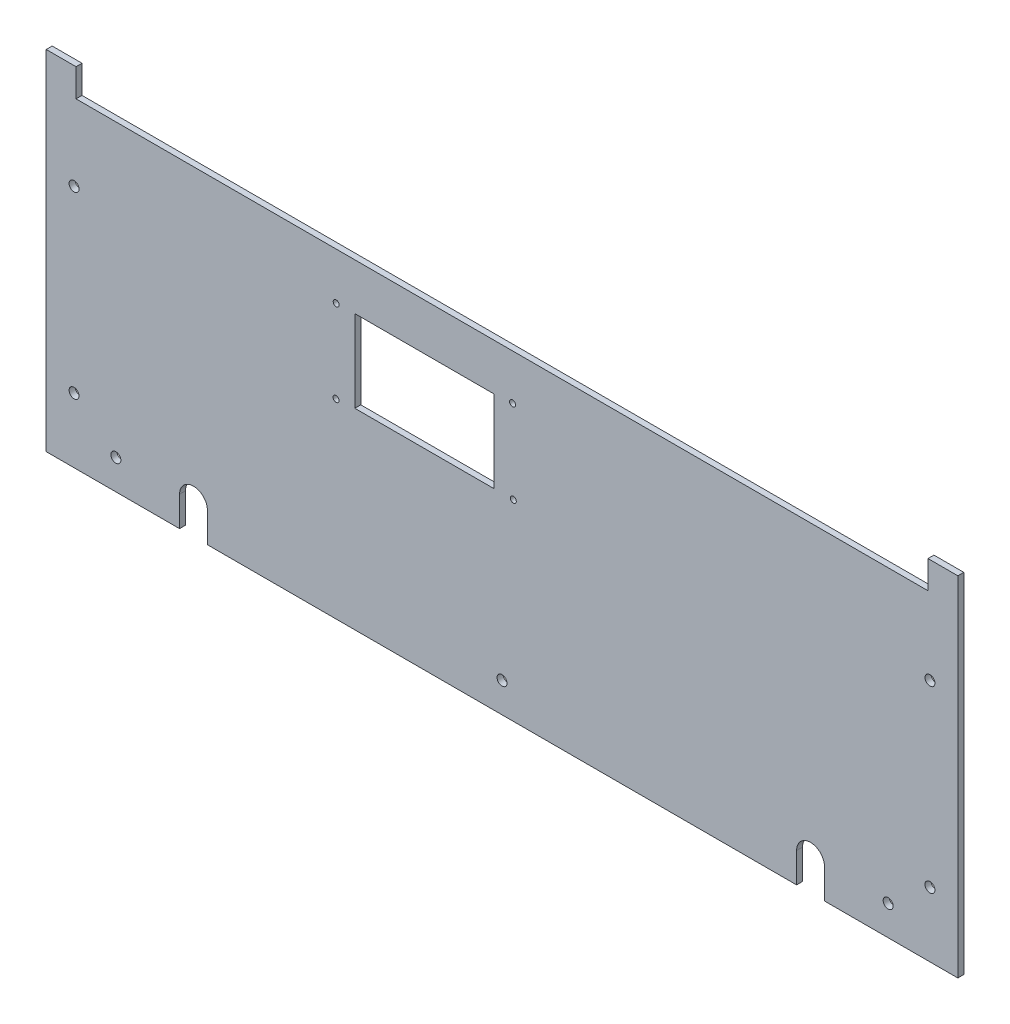
ISO-10303-21;
HEADER;
FILE_DESCRIPTION(('STEP AP214'),'2;1');
FILE_NAME('part.step','',(''),(''),'','','');
FILE_SCHEMA(('AUTOMOTIVE_DESIGN { 1 0 10303 214 1 1 1 1 }'));
ENDSEC;
DATA;
#1=APPLICATION_CONTEXT('core data for automotive mechanical design processes');
#2=APPLICATION_PROTOCOL_DEFINITION('international standard','automotive_design',2000,#1);
#3=PRODUCT_CONTEXT('',#1,'mechanical');
#4=PRODUCT('Part','Part','',(#3));
#5=PRODUCT_RELATED_PRODUCT_CATEGORY('part','',(#4));
#6=PRODUCT_DEFINITION_FORMATION('','',#4);
#7=PRODUCT_DEFINITION_CONTEXT('part definition',#1,'design');
#8=PRODUCT_DEFINITION('design','',#6,#7);
#9=PRODUCT_DEFINITION_SHAPE('','',#8);
#10=(LENGTH_UNIT() NAMED_UNIT(*) SI_UNIT(.MILLI.,.METRE.));
#11=(NAMED_UNIT(*) PLANE_ANGLE_UNIT() SI_UNIT($,.RADIAN.));
#12=(NAMED_UNIT(*) SI_UNIT($,.STERADIAN.) SOLID_ANGLE_UNIT());
#13=UNCERTAINTY_MEASURE_WITH_UNIT(LENGTH_MEASURE(1.E-05),#10,'distance_accuracy_value','');
#14=(GEOMETRIC_REPRESENTATION_CONTEXT(3) GLOBAL_UNCERTAINTY_ASSIGNED_CONTEXT((#13)) GLOBAL_UNIT_ASSIGNED_CONTEXT((#10,
#11,#12)) REPRESENTATION_CONTEXT('',''));
#15=CARTESIAN_POINT('',(0.,0.,0.));
#16=DIRECTION('',(0.,0.,1.));
#17=DIRECTION('',(1.,0.,0.));
#18=AXIS2_PLACEMENT_3D('',#15,#16,#17);
#19=CARTESIAN_POINT('',(-229.,-122.5,3.));
#20=DIRECTION('',(0.,1.,0.));
#21=DIRECTION('',(0.,0.,1.));
#22=AXIS2_PLACEMENT_3D('',#19,#20,#21);
#23=PLANE('',#22);
#24=DIRECTION('',(1.,0.,0.));
#25=VECTOR('',#24,1.);
#26=CARTESIAN_POINT('',(-229.,-122.5,3.));
#27=LINE('',#26,#25);
#28=CARTESIAN_POINT('',(-148.,-122.5,3.));
#29=VERTEX_POINT('',#28);
#30=CARTESIAN_POINT('',(148.,-122.5,3.));
#31=VERTEX_POINT('',#30);
#32=EDGE_CURVE('E201',#29,#31,#27,.T.);
#33=ORIENTED_EDGE('',*,*,#32,.F.);
#34=DIRECTION('',(0.,0.,1.));
#35=VECTOR('',#34,1.);
#36=CARTESIAN_POINT('',(-148.,-122.5,0.));
#37=LINE('',#36,#35);
#38=CARTESIAN_POINT('',(-148.,-122.5,0.));
#39=VERTEX_POINT('',#38);
#40=EDGE_CURVE('E253',#39,#29,#37,.T.);
#41=ORIENTED_EDGE('',*,*,#40,.F.);
#42=DIRECTION('',(1.,0.,0.));
#43=VECTOR('',#42,1.);
#44=CARTESIAN_POINT('',(-229.,-122.5,0.));
#45=LINE('',#44,#43);
#46=CARTESIAN_POINT('',(148.,-122.5,0.));
#47=VERTEX_POINT('',#46);
#48=EDGE_CURVE('E219',#39,#47,#45,.T.);
#49=ORIENTED_EDGE('',*,*,#48,.T.);
#50=DIRECTION('',(0.,0.,1.));
#51=VECTOR('',#50,1.);
#52=CARTESIAN_POINT('',(148.,-122.5,0.));
#53=LINE('',#52,#51);
#54=EDGE_CURVE('E261',#47,#31,#53,.T.);
#55=ORIENTED_EDGE('',*,*,#54,.T.);
#56=EDGE_LOOP('',(#33,#41,#49,#55));
#57=FACE_BOUND('',#56,.T.);
#58=ADVANCED_FACE('F41',(#57),#23,.F.);
#59=CARTESIAN_POINT('',(162.,-122.5,3.));
#60=VERTEX_POINT('',#59);
#61=CARTESIAN_POINT('',(229.,-122.5,3.));
#62=VERTEX_POINT('',#61);
#63=EDGE_CURVE('E198',#60,#62,#27,.T.);
#64=ORIENTED_EDGE('',*,*,#63,.F.);
#65=DIRECTION('',(0.,0.,1.));
#66=VECTOR('',#65,1.);
#67=CARTESIAN_POINT('',(162.,-122.5,0.));
#68=LINE('',#67,#66);
#69=CARTESIAN_POINT('',(162.,-122.5,0.));
#70=VERTEX_POINT('',#69);
#71=EDGE_CURVE('E264',#70,#60,#68,.T.);
#72=ORIENTED_EDGE('',*,*,#71,.F.);
#73=CARTESIAN_POINT('',(229.,-122.5,0.));
#74=VERTEX_POINT('',#73);
#75=EDGE_CURVE('E216',#70,#74,#45,.T.);
#76=ORIENTED_EDGE('',*,*,#75,.T.);
#77=DIRECTION('',(0.,0.,-1.));
#78=VECTOR('',#77,1.);
#79=CARTESIAN_POINT('',(229.,-122.5,3.));
#80=LINE('',#79,#78);
#81=EDGE_CURVE('E209',#62,#74,#80,.T.);
#82=ORIENTED_EDGE('',*,*,#81,.F.);
#83=EDGE_LOOP('',(#64,#72,#76,#82));
#84=FACE_BOUND('',#83,.T.);
#85=ADVANCED_FACE('F306',(#84),#23,.F.);
#86=CARTESIAN_POINT('',(229.,122.5,3.));
#87=DIRECTION('',(-1.,0.,0.));
#88=DIRECTION('',(0.,-1.,0.));
#89=AXIS2_PLACEMENT_3D('',#86,#87,#88);
#90=PLANE('',#89);
#91=DIRECTION('',(0.,1.,0.));
#92=VECTOR('',#91,1.);
#93=CARTESIAN_POINT('',(229.,122.5,0.));
#94=LINE('',#93,#92);
#95=CARTESIAN_POINT('',(229.,52.5,0.));
#96=VERTEX_POINT('',#95);
#97=EDGE_CURVE('E210',#74,#96,#94,.T.);
#98=ORIENTED_EDGE('',*,*,#97,.T.);
#99=DIRECTION('',(0.,0.,1.));
#100=VECTOR('',#99,1.);
#101=CARTESIAN_POINT('',(229.,52.5,-7.));
#102=LINE('',#101,#100);
#103=CARTESIAN_POINT('',(229.,52.5,3.));
#104=VERTEX_POINT('',#103);
#105=EDGE_CURVE('E182',#96,#104,#102,.T.);
#106=ORIENTED_EDGE('',*,*,#105,.T.);
#107=DIRECTION('',(0.,1.,0.));
#108=VECTOR('',#107,1.);
#109=CARTESIAN_POINT('',(229.,122.5,3.));
#110=LINE('',#109,#108);
#111=EDGE_CURVE('E199',#62,#104,#110,.T.);
#112=ORIENTED_EDGE('',*,*,#111,.F.);
#113=ORIENTED_EDGE('',*,*,#81,.T.);
#114=EDGE_LOOP('',(#98,#106,#112,#113));
#115=FACE_BOUND('',#114,.T.);
#116=ADVANCED_FACE('F43',(#115),#90,.F.);
#117=CARTESIAN_POINT('',(-229.,122.5,3.));
#118=DIRECTION('',(1.,0.,0.));
#119=DIRECTION('',(0.,0.,-1.));
#120=AXIS2_PLACEMENT_3D('',#117,#118,#119);
#121=PLANE('',#120);
#122=DIRECTION('',(0.,-1.,0.));
#123=VECTOR('',#122,1.);
#124=CARTESIAN_POINT('',(-229.,122.5,3.));
#125=LINE('',#124,#123);
#126=CARTESIAN_POINT('',(-229.,52.5,3.));
#127=VERTEX_POINT('',#126);
#128=CARTESIAN_POINT('',(-229.,-122.5,3.));
#129=VERTEX_POINT('',#128);
#130=EDGE_CURVE('E189',#127,#129,#125,.T.);
#131=ORIENTED_EDGE('',*,*,#130,.F.);
#132=DIRECTION('',(0.,0.,1.));
#133=VECTOR('',#132,1.);
#134=CARTESIAN_POINT('',(-229.,52.5,-7.));
#135=LINE('',#134,#133);
#136=CARTESIAN_POINT('',(-229.,52.5,0.));
#137=VERTEX_POINT('',#136);
#138=EDGE_CURVE('E175',#137,#127,#135,.T.);
#139=ORIENTED_EDGE('',*,*,#138,.F.);
#140=DIRECTION('',(0.,-1.,0.));
#141=VECTOR('',#140,1.);
#142=CARTESIAN_POINT('',(-229.,122.5,0.));
#143=LINE('',#142,#141);
#144=CARTESIAN_POINT('',(-229.,-122.5,0.));
#145=VERTEX_POINT('',#144);
#146=EDGE_CURVE('E213',#137,#145,#143,.T.);
#147=ORIENTED_EDGE('',*,*,#146,.T.);
#148=DIRECTION('',(0.,0.,-1.));
#149=VECTOR('',#148,1.);
#150=CARTESIAN_POINT('',(-229.,-122.5,3.));
#151=LINE('',#150,#149);
#152=EDGE_CURVE('E49',#129,#145,#151,.T.);
#153=ORIENTED_EDGE('',*,*,#152,.F.);
#154=EDGE_LOOP('',(#131,#139,#147,#153));
#155=FACE_BOUND('',#154,.T.);
#156=ADVANCED_FACE('F195',(#155),#121,.F.);
#157=CARTESIAN_POINT('',(-162.,-122.5,0.));
#158=VERTEX_POINT('',#157);
#159=EDGE_CURVE('E205',#145,#158,#45,.T.);
#160=ORIENTED_EDGE('',*,*,#159,.T.);
#161=DIRECTION('',(0.,0.,1.));
#162=VECTOR('',#161,1.);
#163=CARTESIAN_POINT('',(-162.,-122.5,0.));
#164=LINE('',#163,#162);
#165=CARTESIAN_POINT('',(-162.,-122.5,3.));
#166=VERTEX_POINT('',#165);
#167=EDGE_CURVE('E255',#158,#166,#164,.T.);
#168=ORIENTED_EDGE('',*,*,#167,.T.);
#169=EDGE_CURVE('E203',#129,#166,#27,.T.);
#170=ORIENTED_EDGE('',*,*,#169,.F.);
#171=ORIENTED_EDGE('',*,*,#152,.T.);
#172=EDGE_LOOP('',(#160,#168,#170,#171));
#173=FACE_BOUND('',#172,.T.);
#174=ADVANCED_FACE('F223',(#173),#23,.F.);
#175=CARTESIAN_POINT('',(0.,0.,3.));
#176=DIRECTION('',(0.,0.,1.));
#177=DIRECTION('',(1.,0.,0.));
#178=AXIS2_PLACEMENT_3D('',#175,#176,#177);
#179=PLANE('',#178);
#180=DIRECTION('',(1.,0.,0.));
#181=VECTOR('',#180,1.);
#182=CARTESIAN_POINT('',(-229.,52.5,3.));
#183=LINE('',#182,#181);
#184=CARTESIAN_POINT('',(-214.,52.5,3.));
#185=VERTEX_POINT('',#184);
#186=EDGE_CURVE('E56',#127,#185,#183,.T.);
#187=ORIENTED_EDGE('',*,*,#186,.F.);
#188=ORIENTED_EDGE('',*,*,#130,.T.);
#189=ORIENTED_EDGE('',*,*,#169,.T.);
#190=DIRECTION('',(0.,-1.,0.));
#191=VECTOR('',#190,1.);
#192=CARTESIAN_POINT('',(-162.,-107.5,3.));
#193=LINE('',#192,#191);
#194=CARTESIAN_POINT('',(-162.,-107.5,3.));
#195=VERTEX_POINT('',#194);
#196=EDGE_CURVE('E247',#195,#166,#193,.T.);
#197=ORIENTED_EDGE('',*,*,#196,.F.);
#198=CARTESIAN_POINT('',(-155.,-107.5,3.));
#199=DIRECTION('',(0.,0.,1.));
#200=DIRECTION('',(1.,0.,0.));
#201=AXIS2_PLACEMENT_3D('',#198,#199,#200);
#202=CIRCLE('',#201,6.99999999999998);
#203=CARTESIAN_POINT('',(-148.,-107.5,3.));
#204=VERTEX_POINT('',#203);
#205=EDGE_CURVE('E244',#204,#195,#202,.T.);
#206=ORIENTED_EDGE('',*,*,#205,.F.);
#207=DIRECTION('',(0.,1.,0.));
#208=VECTOR('',#207,1.);
#209=CARTESIAN_POINT('',(-148.,-107.5,3.));
#210=LINE('',#209,#208);
#211=EDGE_CURVE('E240',#29,#204,#210,.T.);
#212=ORIENTED_EDGE('',*,*,#211,.F.);
#213=ORIENTED_EDGE('',*,*,#32,.T.);
#214=DIRECTION('',(0.,-1.,0.));
#215=VECTOR('',#214,1.);
#216=CARTESIAN_POINT('',(148.,-107.5,3.));
#217=LINE('',#216,#215);
#218=CARTESIAN_POINT('',(148.,-107.5,3.));
#219=VERTEX_POINT('',#218);
#220=EDGE_CURVE('E272',#219,#31,#217,.T.);
#221=ORIENTED_EDGE('',*,*,#220,.F.);
#222=CARTESIAN_POINT('',(155.,-107.5,3.));
#223=DIRECTION('',(0.,0.,1.));
#224=DIRECTION('',(1.,0.,0.));
#225=AXIS2_PLACEMENT_3D('',#222,#223,#224);
#226=CIRCLE('',#225,7.00000000000001);
#227=CARTESIAN_POINT('',(162.,-107.5,3.));
#228=VERTEX_POINT('',#227);
#229=EDGE_CURVE('E248',#228,#219,#226,.T.);
#230=ORIENTED_EDGE('',*,*,#229,.F.);
#231=DIRECTION('',(0.,1.,0.));
#232=VECTOR('',#231,1.);
#233=CARTESIAN_POINT('',(162.,-107.5,3.));
#234=LINE('',#233,#232);
#235=EDGE_CURVE('E269',#60,#228,#234,.T.);
#236=ORIENTED_EDGE('',*,*,#235,.F.);
#237=ORIENTED_EDGE('',*,*,#63,.T.);
#238=ORIENTED_EDGE('',*,*,#111,.T.);
#239=CARTESIAN_POINT('',(214.,52.5,3.));
#240=VERTEX_POINT('',#239);
#241=EDGE_CURVE('E193',#240,#104,#183,.T.);
#242=ORIENTED_EDGE('',*,*,#241,.F.);
#243=DIRECTION('',(0.,1.,0.));
#244=VECTOR('',#243,1.);
#245=CARTESIAN_POINT('',(214.,38.5,3.));
#246=LINE('',#245,#244);
#247=CARTESIAN_POINT('',(214.,38.5,3.));
#248=VERTEX_POINT('',#247);
#249=EDGE_CURVE('E366',#248,#240,#246,.T.);
#250=ORIENTED_EDGE('',*,*,#249,.F.);
#251=DIRECTION('',(1.,0.,0.));
#252=VECTOR('',#251,1.);
#253=CARTESIAN_POINT('',(-214.,38.5,3.));
#254=LINE('',#253,#252);
#255=CARTESIAN_POINT('',(-214.,38.5,3.));
#256=VERTEX_POINT('',#255);
#257=EDGE_CURVE('E371',#256,#248,#254,.T.);
#258=ORIENTED_EDGE('',*,*,#257,.F.);
#259=DIRECTION('',(0.,-1.,0.));
#260=VECTOR('',#259,1.);
#261=CARTESIAN_POINT('',(-214.,67.5,3.));
#262=LINE('',#261,#260);
#263=EDGE_CURVE('E192',#185,#256,#262,.T.);
#264=ORIENTED_EDGE('',*,*,#263,.F.);
#265=EDGE_LOOP('',(#187,#188,#189,#197,#206,#212,#213,#221,#230,#236,#237,#238,#242,#250,#258,#264));
#266=FACE_BOUND('',#265,.T.);
#267=CARTESIAN_POINT('',(-83.3679976732874,-26.7379466906975,3.));
#268=DIRECTION('',(0.,0.,1.));
#269=DIRECTION('',(1.,0.,0.));
#270=AXIS2_PLACEMENT_3D('',#267,#268,#269);
#271=CIRCLE('',#270,1.5);
#272=CARTESIAN_POINT('',(-81.8679976732874,-26.7379466906975,3.));
#273=VERTEX_POINT('',#272);
#274=EDGE_CURVE('E321',#273,#273,#271,.T.);
#275=ORIENTED_EDGE('',*,*,#274,.F.);
#276=EDGE_LOOP('',(#275));
#277=FACE_BOUND('',#276,.T.);
#278=CARTESIAN_POINT('',(-83.3,14.88,3.));
#279=DIRECTION('',(0.,0.,1.));
#280=DIRECTION('',(1.,0.,0.));
#281=AXIS2_PLACEMENT_3D('',#278,#279,#280);
#282=CIRCLE('',#281,1.5);
#283=CARTESIAN_POINT('',(-81.8,14.88,3.));
#284=VERTEX_POINT('',#283);
#285=EDGE_CURVE('E838',#284,#284,#282,.T.);
#286=ORIENTED_EDGE('',*,*,#285,.F.);
#287=EDGE_LOOP('',(#286));
#288=FACE_BOUND('',#287,.T.);
#289=CARTESIAN_POINT('',(5.67968750052569,-26.0546733918897,3.));
#290=DIRECTION('',(0.,0.,1.));
#291=DIRECTION('',(1.,0.,0.));
#292=AXIS2_PLACEMENT_3D('',#289,#290,#291);
#293=CIRCLE('',#292,1.5);
#294=CARTESIAN_POINT('',(7.17968750052569,-26.0546733918897,3.));
#295=VERTEX_POINT('',#294);
#296=EDGE_CURVE('E830',#295,#295,#293,.T.);
#297=ORIENTED_EDGE('',*,*,#296,.F.);
#298=EDGE_LOOP('',(#297));
#299=FACE_BOUND('',#298,.T.);
#300=CARTESIAN_POINT('',(5.2961722641175,15.7035655085171,3.));
#301=DIRECTION('',(0.,0.,1.));
#302=DIRECTION('',(1.,0.,0.));
#303=AXIS2_PLACEMENT_3D('',#300,#301,#302);
#304=CIRCLE('',#303,1.5);
#305=CARTESIAN_POINT('',(6.7961722641175,15.7035655085171,3.));
#306=VERTEX_POINT('',#305);
#307=EDGE_CURVE('E347',#306,#306,#304,.T.);
#308=ORIENTED_EDGE('',*,*,#307,.F.);
#309=EDGE_LOOP('',(#308));
#310=FACE_BOUND('',#309,.T.);
#311=DIRECTION('',(0.,1.,0.));
#312=VECTOR('',#311,1.);
#313=CARTESIAN_POINT('',(-4.05000000000001,15.1,3.));
#314=LINE('',#313,#312);
#315=CARTESIAN_POINT('',(-4.05,-26.1,3.));
#316=VERTEX_POINT('',#315);
#317=CARTESIAN_POINT('',(-4.05000000000001,15.1,3.));
#318=VERTEX_POINT('',#317);
#319=EDGE_CURVE('E344',#316,#318,#314,.T.);
#320=ORIENTED_EDGE('',*,*,#319,.F.);
#321=DIRECTION('',(1.,0.,0.));
#322=VECTOR('',#321,1.);
#323=CARTESIAN_POINT('',(-73.95,-26.1,3.));
#324=LINE('',#323,#322);
#325=CARTESIAN_POINT('',(-73.95,-26.1,3.));
#326=VERTEX_POINT('',#325);
#327=EDGE_CURVE('E334',#326,#316,#324,.T.);
#328=ORIENTED_EDGE('',*,*,#327,.F.);
#329=DIRECTION('',(0.,-1.,0.));
#330=VECTOR('',#329,1.);
#331=CARTESIAN_POINT('',(-73.95,15.1,3.));
#332=LINE('',#331,#330);
#333=CARTESIAN_POINT('',(-73.95,15.1,3.));
#334=VERTEX_POINT('',#333);
#335=EDGE_CURVE('E350',#334,#326,#332,.T.);
#336=ORIENTED_EDGE('',*,*,#335,.F.);
#337=DIRECTION('',(-1.,0.,0.));
#338=VECTOR('',#337,1.);
#339=CARTESIAN_POINT('',(-73.95,15.1,3.));
#340=LINE('',#339,#338);
#341=EDGE_CURVE('E346',#318,#334,#340,.T.);
#342=ORIENTED_EDGE('',*,*,#341,.F.);
#343=EDGE_LOOP('',(#320,#328,#336,#342));
#344=FACE_BOUND('',#343,.T.);
#345=CARTESIAN_POINT('',(215.,-90.,3.));
#346=DIRECTION('',(0.,0.,1.));
#347=DIRECTION('',(1.,0.,0.));
#348=AXIS2_PLACEMENT_3D('',#345,#346,#347);
#349=CIRCLE('',#348,2.50000000000002);
#350=CARTESIAN_POINT('',(217.5,-90.,3.));
#351=VERTEX_POINT('',#350);
#352=EDGE_CURVE('E400',#351,#351,#349,.T.);
#353=ORIENTED_EDGE('',*,*,#352,.F.);
#354=EDGE_LOOP('',(#353));
#355=FACE_BOUND('',#354,.T.);
#356=CARTESIAN_POINT('',(215.,0.,3.));
#357=DIRECTION('',(0.,0.,1.));
#358=DIRECTION('',(1.,0.,0.));
#359=AXIS2_PLACEMENT_3D('',#356,#357,#358);
#360=CIRCLE('',#359,2.50000000000002);
#361=CARTESIAN_POINT('',(217.5,0.,3.));
#362=VERTEX_POINT('',#361);
#363=EDGE_CURVE('E394',#362,#362,#360,.T.);
#364=ORIENTED_EDGE('',*,*,#363,.F.);
#365=EDGE_LOOP('',(#364));
#366=FACE_BOUND('',#365,.T.);
#367=CARTESIAN_POINT('',(-215.,-90.0000000000001,3.));
#368=DIRECTION('',(0.,0.,1.));
#369=DIRECTION('',(1.,0.,0.));
#370=AXIS2_PLACEMENT_3D('',#367,#368,#369);
#371=CIRCLE('',#370,2.49999999999997);
#372=CARTESIAN_POINT('',(-212.5,-90.0000000000001,3.));
#373=VERTEX_POINT('',#372);
#374=EDGE_CURVE('E387',#373,#373,#371,.T.);
#375=ORIENTED_EDGE('',*,*,#374,.F.);
#376=EDGE_LOOP('',(#375));
#377=FACE_BOUND('',#376,.T.);
#378=CARTESIAN_POINT('',(-215.,0.,3.));
#379=DIRECTION('',(0.,0.,1.));
#380=DIRECTION('',(1.,0.,0.));
#381=AXIS2_PLACEMENT_3D('',#378,#379,#380);
#382=CIRCLE('',#381,2.49999999999997);
#383=CARTESIAN_POINT('',(-212.5,0.,3.));
#384=VERTEX_POINT('',#383);
#385=EDGE_CURVE('E416',#384,#384,#382,.T.);
#386=ORIENTED_EDGE('',*,*,#385,.F.);
#387=EDGE_LOOP('',(#386));
#388=FACE_BOUND('',#387,.T.);
#389=CARTESIAN_POINT('',(194.,-107.5,3.));
#390=DIRECTION('',(0.,0.,1.));
#391=DIRECTION('',(1.,0.,0.));
#392=AXIS2_PLACEMENT_3D('',#389,#390,#391);
#393=CIRCLE('',#392,2.50000000000009);
#394=CARTESIAN_POINT('',(196.5,-107.5,3.));
#395=VERTEX_POINT('',#394);
#396=EDGE_CURVE('E410',#395,#395,#393,.T.);
#397=ORIENTED_EDGE('',*,*,#396,.F.);
#398=EDGE_LOOP('',(#397));
#399=FACE_BOUND('',#398,.T.);
#400=CARTESIAN_POINT('',(-194.,-107.5,3.));
#401=DIRECTION('',(0.,0.,1.));
#402=DIRECTION('',(1.,0.,0.));
#403=AXIS2_PLACEMENT_3D('',#400,#401,#402);
#404=CIRCLE('',#403,2.50000000000002);
#405=CARTESIAN_POINT('',(-191.5,-107.5,3.));
#406=VERTEX_POINT('',#405);
#407=EDGE_CURVE('E268',#406,#406,#404,.T.);
#408=ORIENTED_EDGE('',*,*,#407,.F.);
#409=EDGE_LOOP('',(#408));
#410=FACE_BOUND('',#409,.T.);
#411=CARTESIAN_POINT('',(0.,-107.5,3.));
#412=DIRECTION('',(0.,0.,1.));
#413=DIRECTION('',(1.,0.,0.));
#414=AXIS2_PLACEMENT_3D('',#411,#412,#413);
#415=CIRCLE('',#414,2.50000000000001);
#416=CARTESIAN_POINT('',(2.50000000000002,-107.5,3.));
#417=VERTEX_POINT('',#416);
#418=EDGE_CURVE('E381',#417,#417,#415,.T.);
#419=ORIENTED_EDGE('',*,*,#418,.F.);
#420=EDGE_LOOP('',(#419));
#421=FACE_BOUND('',#420,.T.);
#422=ADVANCED_FACE('F186',(#266,#277,#288,#299,#310,#344,#355,#366,#377,#388,#399,#410,#421),
#179,.T.);
#423=CARTESIAN_POINT('',(0.,0.,0.));
#424=DIRECTION('',(0.,0.,1.));
#425=DIRECTION('',(1.,0.,0.));
#426=AXIS2_PLACEMENT_3D('',#423,#424,#425);
#427=PLANE('',#426);
#428=CARTESIAN_POINT('',(-83.3679976732874,-26.7379466906975,0.));
#429=DIRECTION('',(0.,0.,1.));
#430=DIRECTION('',(1.,0.,0.));
#431=AXIS2_PLACEMENT_3D('',#428,#429,#430);
#432=CIRCLE('',#431,1.5);
#433=CARTESIAN_POINT('',(-81.8679976732874,-26.7379466906975,0.));
#434=VERTEX_POINT('',#433);
#435=EDGE_CURVE('E318',#434,#434,#432,.T.);
#436=ORIENTED_EDGE('',*,*,#435,.T.);
#437=EDGE_LOOP('',(#436));
#438=FACE_BOUND('',#437,.T.);
#439=CARTESIAN_POINT('',(-83.3,14.88,0.));
#440=DIRECTION('',(0.,0.,1.));
#441=DIRECTION('',(1.,0.,0.));
#442=AXIS2_PLACEMENT_3D('',#439,#440,#441);
#443=CIRCLE('',#442,1.5);
#444=CARTESIAN_POINT('',(-81.8,14.88,0.));
#445=VERTEX_POINT('',#444);
#446=EDGE_CURVE('E326',#445,#445,#443,.T.);
#447=ORIENTED_EDGE('',*,*,#446,.T.);
#448=EDGE_LOOP('',(#447));
#449=FACE_BOUND('',#448,.T.);
#450=CARTESIAN_POINT('',(5.67968750052569,-26.0546733918897,0.));
#451=DIRECTION('',(0.,0.,1.));
#452=DIRECTION('',(1.,0.,0.));
#453=AXIS2_PLACEMENT_3D('',#450,#451,#452);
#454=CIRCLE('',#453,1.5);
#455=CARTESIAN_POINT('',(7.17968750052569,-26.0546733918897,0.));
#456=VERTEX_POINT('',#455);
#457=EDGE_CURVE('E807',#456,#456,#454,.T.);
#458=ORIENTED_EDGE('',*,*,#457,.T.);
#459=EDGE_LOOP('',(#458));
#460=FACE_BOUND('',#459,.T.);
#461=CARTESIAN_POINT('',(5.2961722641175,15.7035655085171,0.));
#462=DIRECTION('',(0.,0.,1.));
#463=DIRECTION('',(1.,0.,0.));
#464=AXIS2_PLACEMENT_3D('',#461,#462,#463);
#465=CIRCLE('',#464,1.5);
#466=CARTESIAN_POINT('',(6.7961722641175,15.7035655085171,0.));
#467=VERTEX_POINT('',#466);
#468=EDGE_CURVE('E811',#467,#467,#465,.T.);
#469=ORIENTED_EDGE('',*,*,#468,.T.);
#470=EDGE_LOOP('',(#469));
#471=FACE_BOUND('',#470,.T.);
#472=DIRECTION('',(1.,0.,0.));
#473=VECTOR('',#472,1.);
#474=CARTESIAN_POINT('',(-73.95,-26.1,0.));
#475=LINE('',#474,#473);
#476=CARTESIAN_POINT('',(-73.95,-26.1,0.));
#477=VERTEX_POINT('',#476);
#478=CARTESIAN_POINT('',(-4.05,-26.1,0.));
#479=VERTEX_POINT('',#478);
#480=EDGE_CURVE('E340',#477,#479,#475,.T.);
#481=ORIENTED_EDGE('',*,*,#480,.T.);
#482=DIRECTION('',(0.,1.,0.));
#483=VECTOR('',#482,1.);
#484=CARTESIAN_POINT('',(-4.05000000000001,15.1,0.));
#485=LINE('',#484,#483);
#486=CARTESIAN_POINT('',(-4.05000000000001,15.1,0.));
#487=VERTEX_POINT('',#486);
#488=EDGE_CURVE('E330',#479,#487,#485,.T.);
#489=ORIENTED_EDGE('',*,*,#488,.T.);
#490=DIRECTION('',(-1.,0.,0.));
#491=VECTOR('',#490,1.);
#492=CARTESIAN_POINT('',(-73.95,15.1,0.));
#493=LINE('',#492,#491);
#494=CARTESIAN_POINT('',(-73.95,15.1,0.));
#495=VERTEX_POINT('',#494);
#496=EDGE_CURVE('E333',#487,#495,#493,.T.);
#497=ORIENTED_EDGE('',*,*,#496,.T.);
#498=DIRECTION('',(0.,-1.,0.));
#499=VECTOR('',#498,1.);
#500=CARTESIAN_POINT('',(-73.95,15.1,0.));
#501=LINE('',#500,#499);
#502=EDGE_CURVE('E337',#495,#477,#501,.T.);
#503=ORIENTED_EDGE('',*,*,#502,.T.);
#504=EDGE_LOOP('',(#481,#489,#497,#503));
#505=FACE_BOUND('',#504,.T.);
#506=ORIENTED_EDGE('',*,*,#146,.F.);
#507=DIRECTION('',(1.,0.,0.));
#508=VECTOR('',#507,1.);
#509=CARTESIAN_POINT('',(0.,52.5,0.));
#510=LINE('',#509,#508);
#511=CARTESIAN_POINT('',(-214.,52.5,0.));
#512=VERTEX_POINT('',#511);
#513=EDGE_CURVE('E178',#137,#512,#510,.T.);
#514=ORIENTED_EDGE('',*,*,#513,.T.);
#515=DIRECTION('',(0.,-1.,0.));
#516=VECTOR('',#515,1.);
#517=CARTESIAN_POINT('',(-214.,67.5,0.));
#518=LINE('',#517,#516);
#519=CARTESIAN_POINT('',(-214.,38.5,0.));
#520=VERTEX_POINT('',#519);
#521=EDGE_CURVE('E363',#512,#520,#518,.T.);
#522=ORIENTED_EDGE('',*,*,#521,.T.);
#523=DIRECTION('',(1.,0.,0.));
#524=VECTOR('',#523,1.);
#525=CARTESIAN_POINT('',(-214.,38.5,0.));
#526=LINE('',#525,#524);
#527=CARTESIAN_POINT('',(214.,38.5,0.));
#528=VERTEX_POINT('',#527);
#529=EDGE_CURVE('E365',#520,#528,#526,.T.);
#530=ORIENTED_EDGE('',*,*,#529,.T.);
#531=DIRECTION('',(0.,1.,0.));
#532=VECTOR('',#531,1.);
#533=CARTESIAN_POINT('',(214.,38.5,0.));
#534=LINE('',#533,#532);
#535=CARTESIAN_POINT('',(214.,52.5,0.));
#536=VERTEX_POINT('',#535);
#537=EDGE_CURVE('E313',#528,#536,#534,.T.);
#538=ORIENTED_EDGE('',*,*,#537,.T.);
#539=EDGE_CURVE('E64',#536,#96,#510,.T.);
#540=ORIENTED_EDGE('',*,*,#539,.T.);
#541=ORIENTED_EDGE('',*,*,#97,.F.);
#542=ORIENTED_EDGE('',*,*,#75,.F.);
#543=DIRECTION('',(0.,1.,0.));
#544=VECTOR('',#543,1.);
#545=CARTESIAN_POINT('',(162.,-107.5,0.));
#546=LINE('',#545,#544);
#547=CARTESIAN_POINT('',(162.,-107.5,0.));
#548=VERTEX_POINT('',#547);
#549=EDGE_CURVE('E260',#70,#548,#546,.T.);
#550=ORIENTED_EDGE('',*,*,#549,.T.);
#551=CARTESIAN_POINT('',(155.,-107.5,0.));
#552=DIRECTION('',(0.,0.,1.));
#553=DIRECTION('',(1.,0.,0.));
#554=AXIS2_PLACEMENT_3D('',#551,#552,#553);
#555=CIRCLE('',#554,7.00000000000001);
#556=CARTESIAN_POINT('',(148.,-107.5,0.));
#557=VERTEX_POINT('',#556);
#558=EDGE_CURVE('E273',#548,#557,#555,.T.);
#559=ORIENTED_EDGE('',*,*,#558,.T.);
#560=DIRECTION('',(0.,-1.,0.));
#561=VECTOR('',#560,1.);
#562=CARTESIAN_POINT('',(148.,-107.5,0.));
#563=LINE('',#562,#561);
#564=EDGE_CURVE('E279',#557,#47,#563,.T.);
#565=ORIENTED_EDGE('',*,*,#564,.T.);
#566=ORIENTED_EDGE('',*,*,#48,.F.);
#567=DIRECTION('',(0.,1.,0.));
#568=VECTOR('',#567,1.);
#569=CARTESIAN_POINT('',(-148.,-107.5,0.));
#570=LINE('',#569,#568);
#571=CARTESIAN_POINT('',(-148.,-107.5,0.));
#572=VERTEX_POINT('',#571);
#573=EDGE_CURVE('E236',#39,#572,#570,.T.);
#574=ORIENTED_EDGE('',*,*,#573,.T.);
#575=CARTESIAN_POINT('',(-155.,-107.5,0.));
#576=DIRECTION('',(0.,0.,1.));
#577=DIRECTION('',(1.,0.,0.));
#578=AXIS2_PLACEMENT_3D('',#575,#576,#577);
#579=CIRCLE('',#578,6.99999999999998);
#580=CARTESIAN_POINT('',(-162.,-107.5,0.));
#581=VERTEX_POINT('',#580);
#582=EDGE_CURVE('E234',#572,#581,#579,.T.);
#583=ORIENTED_EDGE('',*,*,#582,.T.);
#584=DIRECTION('',(0.,-1.,0.));
#585=VECTOR('',#584,1.);
#586=CARTESIAN_POINT('',(-162.,-107.5,0.));
#587=LINE('',#586,#585);
#588=EDGE_CURVE('E231',#581,#158,#587,.T.);
#589=ORIENTED_EDGE('',*,*,#588,.T.);
#590=ORIENTED_EDGE('',*,*,#159,.F.);
#591=EDGE_LOOP('',(#506,#514,#522,#530,#538,#540,#541,#542,#550,#559,#565,#566,#574,#583,#589,#590));
#592=FACE_BOUND('',#591,.T.);
#593=CARTESIAN_POINT('',(215.,-90.,0.));
#594=DIRECTION('',(0.,0.,1.));
#595=DIRECTION('',(1.,0.,0.));
#596=AXIS2_PLACEMENT_3D('',#593,#594,#595);
#597=CIRCLE('',#596,2.50000000000002);
#598=CARTESIAN_POINT('',(217.5,-90.,0.));
#599=VERTEX_POINT('',#598);
#600=EDGE_CURVE('E384',#599,#599,#597,.T.);
#601=ORIENTED_EDGE('',*,*,#600,.T.);
#602=EDGE_LOOP('',(#601));
#603=FACE_BOUND('',#602,.T.);
#604=CARTESIAN_POINT('',(215.,0.,0.));
#605=DIRECTION('',(0.,0.,1.));
#606=DIRECTION('',(1.,0.,0.));
#607=AXIS2_PLACEMENT_3D('',#604,#605,#606);
#608=CIRCLE('',#607,2.50000000000002);
#609=CARTESIAN_POINT('',(217.5,0.,0.));
#610=VERTEX_POINT('',#609);
#611=EDGE_CURVE('E397',#610,#610,#608,.T.);
#612=ORIENTED_EDGE('',*,*,#611,.T.);
#613=EDGE_LOOP('',(#612));
#614=FACE_BOUND('',#613,.T.);
#615=CARTESIAN_POINT('',(-215.,-90.0000000000001,0.));
#616=DIRECTION('',(0.,0.,1.));
#617=DIRECTION('',(1.,0.,0.));
#618=AXIS2_PLACEMENT_3D('',#615,#616,#617);
#619=CIRCLE('',#618,2.49999999999997);
#620=CARTESIAN_POINT('',(-212.5,-90.0000000000001,0.));
#621=VERTEX_POINT('',#620);
#622=EDGE_CURVE('E391',#621,#621,#619,.T.);
#623=ORIENTED_EDGE('',*,*,#622,.T.);
#624=EDGE_LOOP('',(#623));
#625=FACE_BOUND('',#624,.T.);
#626=CARTESIAN_POINT('',(-215.,0.,0.));
#627=DIRECTION('',(0.,0.,1.));
#628=DIRECTION('',(1.,0.,0.));
#629=AXIS2_PLACEMENT_3D('',#626,#627,#628);
#630=CIRCLE('',#629,2.49999999999997);
#631=CARTESIAN_POINT('',(-212.5,0.,0.));
#632=VERTEX_POINT('',#631);
#633=EDGE_CURVE('E390',#632,#632,#630,.T.);
#634=ORIENTED_EDGE('',*,*,#633,.T.);
#635=EDGE_LOOP('',(#634));
#636=FACE_BOUND('',#635,.T.);
#637=CARTESIAN_POINT('',(194.,-107.5,0.));
#638=DIRECTION('',(0.,0.,1.));
#639=DIRECTION('',(1.,0.,0.));
#640=AXIS2_PLACEMENT_3D('',#637,#638,#639);
#641=CIRCLE('',#640,2.50000000000009);
#642=CARTESIAN_POINT('',(196.5,-107.5,0.));
#643=VERTEX_POINT('',#642);
#644=EDGE_CURVE('E413',#643,#643,#641,.T.);
#645=ORIENTED_EDGE('',*,*,#644,.T.);
#646=EDGE_LOOP('',(#645));
#647=FACE_BOUND('',#646,.T.);
#648=CARTESIAN_POINT('',(-194.,-107.5,0.));
#649=DIRECTION('',(0.,0.,1.));
#650=DIRECTION('',(1.,0.,0.));
#651=AXIS2_PLACEMENT_3D('',#648,#649,#650);
#652=CIRCLE('',#651,2.50000000000002);
#653=CARTESIAN_POINT('',(-191.5,-107.5,0.));
#654=VERTEX_POINT('',#653);
#655=EDGE_CURVE('E407',#654,#654,#652,.T.);
#656=ORIENTED_EDGE('',*,*,#655,.T.);
#657=EDGE_LOOP('',(#656));
#658=FACE_BOUND('',#657,.T.);
#659=CARTESIAN_POINT('',(0.,-107.5,0.));
#660=DIRECTION('',(0.,0.,1.));
#661=DIRECTION('',(1.,0.,0.));
#662=AXIS2_PLACEMENT_3D('',#659,#660,#661);
#663=CIRCLE('',#662,2.50000000000001);
#664=CARTESIAN_POINT('',(2.50000000000002,-107.5,0.));
#665=VERTEX_POINT('',#664);
#666=EDGE_CURVE('E378',#665,#665,#663,.T.);
#667=ORIENTED_EDGE('',*,*,#666,.T.);
#668=EDGE_LOOP('',(#667));
#669=FACE_BOUND('',#668,.T.);
#670=ADVANCED_FACE('F227',(#438,#449,#460,#471,#505,#592,#603,#614,#625,#636,#647,#658,#669),
#427,.F.);
#671=CARTESIAN_POINT('',(155.,-107.5,0.));
#672=DIRECTION('',(0.,0.,1.));
#673=DIRECTION('',(1.,0.,0.));
#674=AXIS2_PLACEMENT_3D('',#671,#672,#673);
#675=CYLINDRICAL_SURFACE('',#674,7.00000000000001);
#676=ORIENTED_EDGE('',*,*,#229,.T.);
#677=DIRECTION('',(0.,0.,1.));
#678=VECTOR('',#677,1.);
#679=CARTESIAN_POINT('',(148.,-107.5,0.));
#680=LINE('',#679,#678);
#681=EDGE_CURVE('E258',#557,#219,#680,.T.);
#682=ORIENTED_EDGE('',*,*,#681,.F.);
#683=ORIENTED_EDGE('',*,*,#558,.F.);
#684=DIRECTION('',(0.,0.,1.));
#685=VECTOR('',#684,1.);
#686=CARTESIAN_POINT('',(162.,-107.5,0.));
#687=LINE('',#686,#685);
#688=EDGE_CURVE('E266',#548,#228,#687,.T.);
#689=ORIENTED_EDGE('',*,*,#688,.T.);
#690=EDGE_LOOP('',(#676,#682,#683,#689));
#691=FACE_BOUND('',#690,.T.);
#692=ADVANCED_FACE('F288',(#691),#675,.F.);
#693=CARTESIAN_POINT('',(162.,-107.5,0.));
#694=DIRECTION('',(1.,0.,0.));
#695=DIRECTION('',(0.,0.,-1.));
#696=AXIS2_PLACEMENT_3D('',#693,#694,#695);
#697=PLANE('',#696);
#698=ORIENTED_EDGE('',*,*,#235,.T.);
#699=ORIENTED_EDGE('',*,*,#688,.F.);
#700=ORIENTED_EDGE('',*,*,#549,.F.);
#701=ORIENTED_EDGE('',*,*,#71,.T.);
#702=EDGE_LOOP('',(#698,#699,#700,#701));
#703=FACE_BOUND('',#702,.T.);
#704=ADVANCED_FACE('F495',(#703),#697,.F.);
#705=CARTESIAN_POINT('',(148.,-107.5,0.));
#706=DIRECTION('',(-1.,0.,0.));
#707=DIRECTION('',(0.,0.,1.));
#708=AXIS2_PLACEMENT_3D('',#705,#706,#707);
#709=PLANE('',#708);
#710=ORIENTED_EDGE('',*,*,#220,.T.);
#711=ORIENTED_EDGE('',*,*,#54,.F.);
#712=ORIENTED_EDGE('',*,*,#564,.F.);
#713=ORIENTED_EDGE('',*,*,#681,.T.);
#714=EDGE_LOOP('',(#710,#711,#712,#713));
#715=FACE_BOUND('',#714,.T.);
#716=ADVANCED_FACE('F292',(#715),#709,.F.);
#717=CARTESIAN_POINT('',(-155.,-107.5,0.));
#718=DIRECTION('',(0.,0.,1.));
#719=DIRECTION('',(1.,0.,0.));
#720=AXIS2_PLACEMENT_3D('',#717,#718,#719);
#721=CYLINDRICAL_SURFACE('',#720,6.99999999999998);
#722=ORIENTED_EDGE('',*,*,#205,.T.);
#723=DIRECTION('',(0.,0.,1.));
#724=VECTOR('',#723,1.);
#725=CARTESIAN_POINT('',(-162.,-107.5,0.));
#726=LINE('',#725,#724);
#727=EDGE_CURVE('E238',#581,#195,#726,.T.);
#728=ORIENTED_EDGE('',*,*,#727,.F.);
#729=ORIENTED_EDGE('',*,*,#582,.F.);
#730=DIRECTION('',(0.,0.,1.));
#731=VECTOR('',#730,1.);
#732=CARTESIAN_POINT('',(-148.,-107.5,0.));
#733=LINE('',#732,#731);
#734=EDGE_CURVE('E214',#572,#204,#733,.T.);
#735=ORIENTED_EDGE('',*,*,#734,.T.);
#736=EDGE_LOOP('',(#722,#728,#729,#735));
#737=FACE_BOUND('',#736,.T.);
#738=ADVANCED_FACE('F517',(#737),#721,.F.);
#739=CARTESIAN_POINT('',(-148.,-107.5,0.));
#740=DIRECTION('',(1.,0.,0.));
#741=DIRECTION('',(0.,1.,0.));
#742=AXIS2_PLACEMENT_3D('',#739,#740,#741);
#743=PLANE('',#742);
#744=ORIENTED_EDGE('',*,*,#211,.T.);
#745=ORIENTED_EDGE('',*,*,#734,.F.);
#746=ORIENTED_EDGE('',*,*,#573,.F.);
#747=ORIENTED_EDGE('',*,*,#40,.T.);
#748=EDGE_LOOP('',(#744,#745,#746,#747));
#749=FACE_BOUND('',#748,.T.);
#750=ADVANCED_FACE('F301',(#749),#743,.F.);
#751=CARTESIAN_POINT('',(-162.,-107.5,0.));
#752=DIRECTION('',(-1.,0.,0.));
#753=DIRECTION('',(0.,0.,1.));
#754=AXIS2_PLACEMENT_3D('',#751,#752,#753);
#755=PLANE('',#754);
#756=ORIENTED_EDGE('',*,*,#196,.T.);
#757=ORIENTED_EDGE('',*,*,#167,.F.);
#758=ORIENTED_EDGE('',*,*,#588,.F.);
#759=ORIENTED_EDGE('',*,*,#727,.T.);
#760=EDGE_LOOP('',(#756,#757,#758,#759));
#761=FACE_BOUND('',#760,.T.);
#762=ADVANCED_FACE('F443',(#761),#755,.F.);
#763=CARTESIAN_POINT('',(0.,-107.5,0.));
#764=DIRECTION('',(0.,0.,1.));
#765=DIRECTION('',(1.,0.,0.));
#766=AXIS2_PLACEMENT_3D('',#763,#764,#765);
#767=CYLINDRICAL_SURFACE('',#766,2.50000000000001);
#768=ORIENTED_EDGE('',*,*,#666,.F.);
#769=EDGE_LOOP('',(#768));
#770=FACE_BOUND('',#769,.T.);
#771=ORIENTED_EDGE('',*,*,#418,.T.);
#772=EDGE_LOOP('',(#771));
#773=FACE_BOUND('',#772,.T.);
#774=ADVANCED_FACE('F440',(#770,#773),#767,.F.);
#775=CARTESIAN_POINT('',(-194.,-107.5,0.));
#776=DIRECTION('',(0.,0.,1.));
#777=DIRECTION('',(1.,0.,0.));
#778=AXIS2_PLACEMENT_3D('',#775,#776,#777);
#779=CYLINDRICAL_SURFACE('',#778,2.50000000000002);
#780=ORIENTED_EDGE('',*,*,#655,.F.);
#781=EDGE_LOOP('',(#780));
#782=FACE_BOUND('',#781,.T.);
#783=ORIENTED_EDGE('',*,*,#407,.T.);
#784=EDGE_LOOP('',(#783));
#785=FACE_BOUND('',#784,.T.);
#786=ADVANCED_FACE('F442',(#782,#785),#779,.F.);
#787=CARTESIAN_POINT('',(194.,-107.5,0.));
#788=DIRECTION('',(0.,0.,1.));
#789=DIRECTION('',(1.,0.,0.));
#790=AXIS2_PLACEMENT_3D('',#787,#788,#789);
#791=CYLINDRICAL_SURFACE('',#790,2.50000000000009);
#792=ORIENTED_EDGE('',*,*,#644,.F.);
#793=EDGE_LOOP('',(#792));
#794=FACE_BOUND('',#793,.T.);
#795=ORIENTED_EDGE('',*,*,#396,.T.);
#796=EDGE_LOOP('',(#795));
#797=FACE_BOUND('',#796,.T.);
#798=ADVANCED_FACE('F427',(#794,#797),#791,.F.);
#799=CARTESIAN_POINT('',(-215.,0.,0.));
#800=DIRECTION('',(0.,0.,1.));
#801=DIRECTION('',(1.,0.,0.));
#802=AXIS2_PLACEMENT_3D('',#799,#800,#801);
#803=CYLINDRICAL_SURFACE('',#802,2.49999999999997);
#804=ORIENTED_EDGE('',*,*,#633,.F.);
#805=EDGE_LOOP('',(#804));
#806=FACE_BOUND('',#805,.T.);
#807=ORIENTED_EDGE('',*,*,#385,.T.);
#808=EDGE_LOOP('',(#807));
#809=FACE_BOUND('',#808,.T.);
#810=ADVANCED_FACE('F423',(#806,#809),#803,.F.);
#811=CARTESIAN_POINT('',(-215.,-90.0000000000001,0.));
#812=DIRECTION('',(0.,0.,1.));
#813=DIRECTION('',(1.,0.,0.));
#814=AXIS2_PLACEMENT_3D('',#811,#812,#813);
#815=CYLINDRICAL_SURFACE('',#814,2.49999999999997);
#816=ORIENTED_EDGE('',*,*,#622,.F.);
#817=EDGE_LOOP('',(#816));
#818=FACE_BOUND('',#817,.T.);
#819=ORIENTED_EDGE('',*,*,#374,.T.);
#820=EDGE_LOOP('',(#819));
#821=FACE_BOUND('',#820,.T.);
#822=ADVANCED_FACE('F426',(#818,#821),#815,.F.);
#823=CARTESIAN_POINT('',(215.,0.,0.));
#824=DIRECTION('',(0.,0.,1.));
#825=DIRECTION('',(1.,0.,0.));
#826=AXIS2_PLACEMENT_3D('',#823,#824,#825);
#827=CYLINDRICAL_SURFACE('',#826,2.50000000000002);
#828=ORIENTED_EDGE('',*,*,#611,.F.);
#829=EDGE_LOOP('',(#828));
#830=FACE_BOUND('',#829,.T.);
#831=ORIENTED_EDGE('',*,*,#363,.T.);
#832=EDGE_LOOP('',(#831));
#833=FACE_BOUND('',#832,.T.);
#834=ADVANCED_FACE('F582',(#830,#833),#827,.F.);
#835=CARTESIAN_POINT('',(215.,-90.,0.));
#836=DIRECTION('',(0.,0.,1.));
#837=DIRECTION('',(1.,0.,0.));
#838=AXIS2_PLACEMENT_3D('',#835,#836,#837);
#839=CYLINDRICAL_SURFACE('',#838,2.50000000000002);
#840=ORIENTED_EDGE('',*,*,#600,.F.);
#841=EDGE_LOOP('',(#840));
#842=FACE_BOUND('',#841,.T.);
#843=ORIENTED_EDGE('',*,*,#352,.T.);
#844=EDGE_LOOP('',(#843));
#845=FACE_BOUND('',#844,.T.);
#846=ADVANCED_FACE('F592',(#842,#845),#839,.F.);
#847=CARTESIAN_POINT('',(-214.,67.5,0.));
#848=DIRECTION('',(-1.,0.,0.));
#849=DIRECTION('',(0.,0.,1.));
#850=AXIS2_PLACEMENT_3D('',#847,#848,#849);
#851=PLANE('',#850);
#852=ORIENTED_EDGE('',*,*,#521,.F.);
#853=DIRECTION('',(0.,0.,1.));
#854=VECTOR('',#853,1.);
#855=CARTESIAN_POINT('',(-214.,52.5,0.));
#856=LINE('',#855,#854);
#857=EDGE_CURVE('E314',#512,#185,#856,.T.);
#858=ORIENTED_EDGE('',*,*,#857,.T.);
#859=ORIENTED_EDGE('',*,*,#263,.T.);
#860=DIRECTION('',(0.,0.,1.));
#861=VECTOR('',#860,1.);
#862=CARTESIAN_POINT('',(-214.,38.5,0.));
#863=LINE('',#862,#861);
#864=EDGE_CURVE('E369',#520,#256,#863,.T.);
#865=ORIENTED_EDGE('',*,*,#864,.F.);
#866=EDGE_LOOP('',(#852,#858,#859,#865));
#867=FACE_BOUND('',#866,.T.);
#868=ADVANCED_FACE('F603',(#867),#851,.F.);
#869=CARTESIAN_POINT('',(214.,38.5,0.));
#870=DIRECTION('',(1.,0.,0.));
#871=DIRECTION('',(0.,0.,-1.));
#872=AXIS2_PLACEMENT_3D('',#869,#870,#871);
#873=PLANE('',#872);
#874=ORIENTED_EDGE('',*,*,#249,.T.);
#875=DIRECTION('',(0.,0.,-1.));
#876=VECTOR('',#875,1.);
#877=CARTESIAN_POINT('',(214.,52.5,0.));
#878=LINE('',#877,#876);
#879=EDGE_CURVE('E11',#240,#536,#878,.T.);
#880=ORIENTED_EDGE('',*,*,#879,.T.);
#881=ORIENTED_EDGE('',*,*,#537,.F.);
#882=DIRECTION('',(0.,0.,1.));
#883=VECTOR('',#882,1.);
#884=CARTESIAN_POINT('',(214.,38.5,0.));
#885=LINE('',#884,#883);
#886=EDGE_CURVE('E376',#528,#248,#885,.T.);
#887=ORIENTED_EDGE('',*,*,#886,.T.);
#888=EDGE_LOOP('',(#874,#880,#881,#887));
#889=FACE_BOUND('',#888,.T.);
#890=ADVANCED_FACE('F618',(#889),#873,.F.);
#891=CARTESIAN_POINT('',(-214.,38.5,0.));
#892=DIRECTION('',(0.,-1.,0.));
#893=DIRECTION('',(0.,0.,-1.));
#894=AXIS2_PLACEMENT_3D('',#891,#892,#893);
#895=PLANE('',#894);
#896=ORIENTED_EDGE('',*,*,#257,.T.);
#897=ORIENTED_EDGE('',*,*,#886,.F.);
#898=ORIENTED_EDGE('',*,*,#529,.F.);
#899=ORIENTED_EDGE('',*,*,#864,.T.);
#900=EDGE_LOOP('',(#896,#897,#898,#899));
#901=FACE_BOUND('',#900,.T.);
#902=ADVANCED_FACE('F612',(#901),#895,.F.);
#903=CARTESIAN_POINT('',(-4.05000000000001,15.1,0.));
#904=DIRECTION('',(1.,0.,0.));
#905=DIRECTION('',(0.,1.,0.));
#906=AXIS2_PLACEMENT_3D('',#903,#904,#905);
#907=PLANE('',#906);
#908=ORIENTED_EDGE('',*,*,#319,.T.);
#909=DIRECTION('',(0.,0.,1.));
#910=VECTOR('',#909,1.);
#911=CARTESIAN_POINT('',(-4.05000000000001,15.1,0.));
#912=LINE('',#911,#910);
#913=EDGE_CURVE('E343',#487,#318,#912,.T.);
#914=ORIENTED_EDGE('',*,*,#913,.F.);
#915=ORIENTED_EDGE('',*,*,#488,.F.);
#916=DIRECTION('',(0.,0.,1.));
#917=VECTOR('',#916,1.);
#918=CARTESIAN_POINT('',(-4.05,-26.1,0.));
#919=LINE('',#918,#917);
#920=EDGE_CURVE('E355',#479,#316,#919,.T.);
#921=ORIENTED_EDGE('',*,*,#920,.T.);
#922=EDGE_LOOP('',(#908,#914,#915,#921));
#923=FACE_BOUND('',#922,.T.);
#924=ADVANCED_FACE('F617',(#923),#907,.F.);
#925=CARTESIAN_POINT('',(-73.95,-26.1,0.));
#926=DIRECTION('',(0.,-1.,0.));
#927=DIRECTION('',(0.,0.,-1.));
#928=AXIS2_PLACEMENT_3D('',#925,#926,#927);
#929=PLANE('',#928);
#930=ORIENTED_EDGE('',*,*,#327,.T.);
#931=ORIENTED_EDGE('',*,*,#920,.F.);
#932=ORIENTED_EDGE('',*,*,#480,.F.);
#933=DIRECTION('',(0.,0.,1.));
#934=VECTOR('',#933,1.);
#935=CARTESIAN_POINT('',(-73.95,-26.1,0.));
#936=LINE('',#935,#934);
#937=EDGE_CURVE('E357',#477,#326,#936,.T.);
#938=ORIENTED_EDGE('',*,*,#937,.T.);
#939=EDGE_LOOP('',(#930,#931,#932,#938));
#940=FACE_BOUND('',#939,.T.);
#941=ADVANCED_FACE('F631',(#940),#929,.F.);
#942=CARTESIAN_POINT('',(-73.95,15.1,0.));
#943=DIRECTION('',(-1.,0.,0.));
#944=DIRECTION('',(0.,0.,1.));
#945=AXIS2_PLACEMENT_3D('',#942,#943,#944);
#946=PLANE('',#945);
#947=ORIENTED_EDGE('',*,*,#335,.T.);
#948=ORIENTED_EDGE('',*,*,#937,.F.);
#949=ORIENTED_EDGE('',*,*,#502,.F.);
#950=DIRECTION('',(0.,0.,1.));
#951=VECTOR('',#950,1.);
#952=CARTESIAN_POINT('',(-73.95,15.1,0.));
#953=LINE('',#952,#951);
#954=EDGE_CURVE('E359',#495,#334,#953,.T.);
#955=ORIENTED_EDGE('',*,*,#954,.T.);
#956=EDGE_LOOP('',(#947,#948,#949,#955));
#957=FACE_BOUND('',#956,.T.);
#958=ADVANCED_FACE('F642',(#957),#946,.F.);
#959=CARTESIAN_POINT('',(-73.95,15.1,0.));
#960=DIRECTION('',(0.,1.,0.));
#961=DIRECTION('',(0.,0.,1.));
#962=AXIS2_PLACEMENT_3D('',#959,#960,#961);
#963=PLANE('',#962);
#964=ORIENTED_EDGE('',*,*,#341,.T.);
#965=ORIENTED_EDGE('',*,*,#954,.F.);
#966=ORIENTED_EDGE('',*,*,#496,.F.);
#967=ORIENTED_EDGE('',*,*,#913,.T.);
#968=EDGE_LOOP('',(#964,#965,#966,#967));
#969=FACE_BOUND('',#968,.T.);
#970=ADVANCED_FACE('F653',(#969),#963,.F.);
#971=CARTESIAN_POINT('',(5.2961722641175,15.7035655085171,0.));
#972=DIRECTION('',(0.,0.,1.));
#973=DIRECTION('',(1.,0.,0.));
#974=AXIS2_PLACEMENT_3D('',#971,#972,#973);
#975=CYLINDRICAL_SURFACE('',#974,1.5);
#976=ORIENTED_EDGE('',*,*,#468,.F.);
#977=EDGE_LOOP('',(#976));
#978=FACE_BOUND('',#977,.T.);
#979=ORIENTED_EDGE('',*,*,#307,.T.);
#980=EDGE_LOOP('',(#979));
#981=FACE_BOUND('',#980,.T.);
#982=ADVANCED_FACE('F664',(#978,#981),#975,.F.);
#983=CARTESIAN_POINT('',(5.67968750052569,-26.0546733918897,0.));
#984=DIRECTION('',(0.,0.,1.));
#985=DIRECTION('',(1.,0.,0.));
#986=AXIS2_PLACEMENT_3D('',#983,#984,#985);
#987=CYLINDRICAL_SURFACE('',#986,1.5);
#988=ORIENTED_EDGE('',*,*,#457,.F.);
#989=EDGE_LOOP('',(#988));
#990=FACE_BOUND('',#989,.T.);
#991=ORIENTED_EDGE('',*,*,#296,.T.);
#992=EDGE_LOOP('',(#991));
#993=FACE_BOUND('',#992,.T.);
#994=ADVANCED_FACE('F675',(#990,#993),#987,.F.);
#995=CARTESIAN_POINT('',(-83.3,14.88,0.));
#996=DIRECTION('',(0.,0.,1.));
#997=DIRECTION('',(1.,0.,0.));
#998=AXIS2_PLACEMENT_3D('',#995,#996,#997);
#999=CYLINDRICAL_SURFACE('',#998,1.5);
#1000=ORIENTED_EDGE('',*,*,#446,.F.);
#1001=EDGE_LOOP('',(#1000));
#1002=FACE_BOUND('',#1001,.T.);
#1003=ORIENTED_EDGE('',*,*,#285,.T.);
#1004=EDGE_LOOP('',(#1003));
#1005=FACE_BOUND('',#1004,.T.);
#1006=ADVANCED_FACE('F686',(#1002,#1005),#999,.F.);
#1007=CARTESIAN_POINT('',(-83.3679976732874,-26.7379466906975,0.));
#1008=DIRECTION('',(0.,0.,1.));
#1009=DIRECTION('',(1.,0.,0.));
#1010=AXIS2_PLACEMENT_3D('',#1007,#1008,#1009);
#1011=CYLINDRICAL_SURFACE('',#1010,1.5);
#1012=ORIENTED_EDGE('',*,*,#435,.F.);
#1013=EDGE_LOOP('',(#1012));
#1014=FACE_BOUND('',#1013,.T.);
#1015=ORIENTED_EDGE('',*,*,#274,.T.);
#1016=EDGE_LOOP('',(#1015));
#1017=FACE_BOUND('',#1016,.T.);
#1018=ADVANCED_FACE('F696',(#1014,#1017),#1011,.F.);
#1019=CARTESIAN_POINT('',(-229.,52.5,-7.));
#1020=DIRECTION('',(0.,-1.,0.));
#1021=DIRECTION('',(0.,0.,-1.));
#1022=AXIS2_PLACEMENT_3D('',#1019,#1020,#1021);
#1023=PLANE('',#1022);
#1024=ORIENTED_EDGE('',*,*,#879,.F.);
#1025=ORIENTED_EDGE('',*,*,#241,.T.);
#1026=ORIENTED_EDGE('',*,*,#105,.F.);
#1027=ORIENTED_EDGE('',*,*,#539,.F.);
#1028=EDGE_LOOP('',(#1024,#1025,#1026,#1027));
#1029=FACE_BOUND('',#1028,.T.);
#1030=ADVANCED_FACE('F706',(#1029),#1023,.F.);
#1031=ORIENTED_EDGE('',*,*,#138,.T.);
#1032=ORIENTED_EDGE('',*,*,#186,.T.);
#1033=ORIENTED_EDGE('',*,*,#857,.F.);
#1034=ORIENTED_EDGE('',*,*,#513,.F.);
#1035=EDGE_LOOP('',(#1031,#1032,#1033,#1034));
#1036=FACE_BOUND('',#1035,.T.);
#1037=ADVANCED_FACE('F176',(#1036),#1023,.F.);
#1038=CLOSED_SHELL('',(#58,#85,#116,#156,#174,#422,#670,#692,#704,#716,#738,#750,#762,#774,#786,
#798,#810,#822,#834,#846,#868,#890,#902,#924,#941,#958,#970,#982,#994,#1006,#1018,#1030,#1037));
#1039=MANIFOLD_SOLID_BREP('B2',#1038);
#1040=ADVANCED_BREP_SHAPE_REPRESENTATION('',(#18,#1039),#14);
#1041=SHAPE_DEFINITION_REPRESENTATION(#9,#1040);
ENDSEC;
END-ISO-10303-21;
